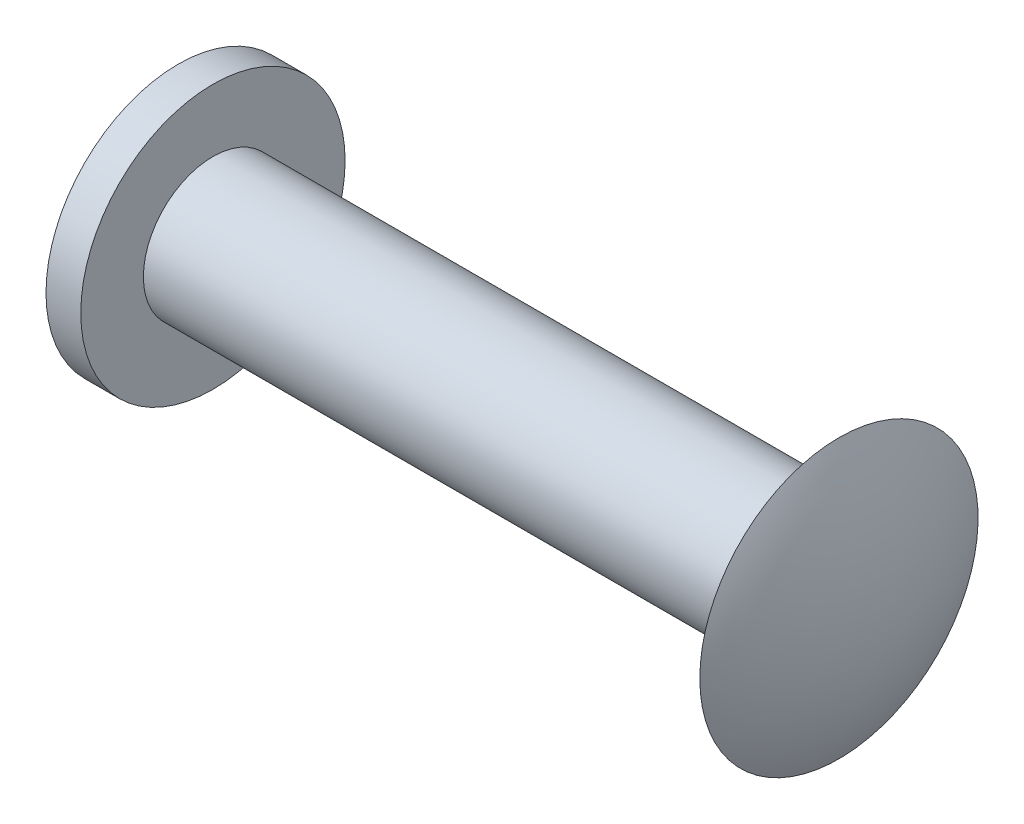
ISO-10303-21;
HEADER;
FILE_DESCRIPTION(('STEP AP214'),'2;1');
FILE_NAME('part.step','',(''),(''),'','','');
FILE_SCHEMA(('AUTOMOTIVE_DESIGN { 1 0 10303 214 1 1 1 1 }'));
ENDSEC;
DATA;
#1=APPLICATION_CONTEXT('core data for automotive mechanical design processes');
#2=APPLICATION_PROTOCOL_DEFINITION('international standard','automotive_design',2000,#1);
#3=PRODUCT_CONTEXT('',#1,'mechanical');
#4=PRODUCT('Part','Part','',(#3));
#5=PRODUCT_RELATED_PRODUCT_CATEGORY('part','',(#4));
#6=PRODUCT_DEFINITION_FORMATION('','',#4);
#7=PRODUCT_DEFINITION_CONTEXT('part definition',#1,'design');
#8=PRODUCT_DEFINITION('design','',#6,#7);
#9=PRODUCT_DEFINITION_SHAPE('','',#8);
#10=(LENGTH_UNIT() NAMED_UNIT(*) SI_UNIT(.MILLI.,.METRE.));
#11=(NAMED_UNIT(*) PLANE_ANGLE_UNIT() SI_UNIT($,.RADIAN.));
#12=(NAMED_UNIT(*) SI_UNIT($,.STERADIAN.) SOLID_ANGLE_UNIT());
#13=UNCERTAINTY_MEASURE_WITH_UNIT(LENGTH_MEASURE(1.E-05),#10,'distance_accuracy_value','');
#14=(GEOMETRIC_REPRESENTATION_CONTEXT(3) GLOBAL_UNCERTAINTY_ASSIGNED_CONTEXT((#13)) GLOBAL_UNIT_ASSIGNED_CONTEXT((#10,
#11,#12)) REPRESENTATION_CONTEXT('',''));
#15=CARTESIAN_POINT('',(0.,0.,0.));
#16=DIRECTION('',(0.,0.,1.));
#17=DIRECTION('',(1.,0.,0.));
#18=AXIS2_PLACEMENT_3D('',#15,#16,#17);
#19=CARTESIAN_POINT('',(0.,0.,0.));
#20=DIRECTION('',(1.,0.,0.));
#21=DIRECTION('',(0.,0.,-1.));
#22=AXIS2_PLACEMENT_3D('',#19,#20,#21);
#23=PLANE('',#22);
#24=CARTESIAN_POINT('',(0.,0.,0.));
#25=DIRECTION('',(-1.,0.,0.));
#26=DIRECTION('',(0.,0.,1.));
#27=AXIS2_PLACEMENT_3D('',#24,#25,#26);
#28=CIRCLE('',#27,1.9);
#29=CARTESIAN_POINT('',(0.,0.,1.9));
#30=VERTEX_POINT('',#29);
#31=EDGE_CURVE('E10',#30,#30,#28,.T.);
#32=ORIENTED_EDGE('',*,*,#31,.T.);
#33=EDGE_LOOP('',(#32));
#34=FACE_BOUND('',#33,.T.);
#35=ADVANCED_FACE('F38',(#34),#23,.F.);
#36=CARTESIAN_POINT('',(9.5,0.,0.));
#37=DIRECTION('',(-1.,0.,0.));
#38=DIRECTION('',(0.,0.,1.));
#39=AXIS2_PLACEMENT_3D('',#36,#37,#38);
#40=CYLINDRICAL_SURFACE('',#39,1.9);
#41=ORIENTED_EDGE('',*,*,#31,.F.);
#42=EDGE_LOOP('',(#41));
#43=FACE_BOUND('',#42,.T.);
#44=CARTESIAN_POINT('',(0.5,0.,0.));
#45=DIRECTION('',(-1.,0.,0.));
#46=DIRECTION('',(0.,0.,1.));
#47=AXIS2_PLACEMENT_3D('',#44,#45,#46);
#48=CIRCLE('',#47,1.9);
#49=CARTESIAN_POINT('',(0.5,0.,1.9));
#50=VERTEX_POINT('',#49);
#51=EDGE_CURVE('E45',#50,#50,#48,.T.);
#52=ORIENTED_EDGE('',*,*,#51,.T.);
#53=EDGE_LOOP('',(#52));
#54=FACE_BOUND('',#53,.T.);
#55=ADVANCED_FACE('F81',(#43,#54),#40,.T.);
#56=CARTESIAN_POINT('',(0.5,1.9,0.));
#57=DIRECTION('',(-1.,0.,0.));
#58=DIRECTION('',(0.,0.,1.));
#59=AXIS2_PLACEMENT_3D('',#56,#57,#58);
#60=PLANE('',#59);
#61=ORIENTED_EDGE('',*,*,#51,.F.);
#62=EDGE_LOOP('',(#61));
#63=FACE_BOUND('',#62,.T.);
#64=CARTESIAN_POINT('',(0.5,0.,0.));
#65=DIRECTION('',(-1.,0.,0.));
#66=DIRECTION('',(0.,0.,1.));
#67=AXIS2_PLACEMENT_3D('',#64,#65,#66);
#68=CIRCLE('',#67,1.);
#69=CARTESIAN_POINT('',(0.5,0.,1.));
#70=VERTEX_POINT('',#69);
#71=EDGE_CURVE('E52',#70,#70,#68,.T.);
#72=ORIENTED_EDGE('',*,*,#71,.T.);
#73=EDGE_LOOP('',(#72));
#74=FACE_BOUND('',#73,.T.);
#75=ADVANCED_FACE('F85',(#63,#74),#60,.F.);
#76=CARTESIAN_POINT('',(9.5,0.,0.));
#77=DIRECTION('',(-1.,0.,0.));
#78=DIRECTION('',(0.,0.,1.));
#79=AXIS2_PLACEMENT_3D('',#76,#77,#78);
#80=CYLINDRICAL_SURFACE('',#79,1.);
#81=ORIENTED_EDGE('',*,*,#71,.F.);
#82=EDGE_LOOP('',(#81));
#83=FACE_BOUND('',#82,.T.);
#84=CARTESIAN_POINT('',(9.5,0.,0.));
#85=DIRECTION('',(-1.,0.,0.));
#86=DIRECTION('',(0.,0.,1.));
#87=AXIS2_PLACEMENT_3D('',#84,#85,#86);
#88=CIRCLE('',#87,1.);
#89=CARTESIAN_POINT('',(9.5,0.,1.));
#90=VERTEX_POINT('',#89);
#91=EDGE_CURVE('E58',#90,#90,#88,.T.);
#92=ORIENTED_EDGE('',*,*,#91,.T.);
#93=EDGE_LOOP('',(#92));
#94=FACE_BOUND('',#93,.T.);
#95=ADVANCED_FACE('F77',(#83,#94),#80,.T.);
#96=CARTESIAN_POINT('',(9.5,1.,0.));
#97=DIRECTION('',(1.,0.,0.));
#98=DIRECTION('',(0.,0.,-1.));
#99=AXIS2_PLACEMENT_3D('',#96,#97,#98);
#100=PLANE('',#99);
#101=ORIENTED_EDGE('',*,*,#91,.F.);
#102=EDGE_LOOP('',(#101));
#103=FACE_BOUND('',#102,.T.);
#104=CARTESIAN_POINT('',(9.5,0.,0.));
#105=DIRECTION('',(-1.,0.,0.));
#106=DIRECTION('',(0.,0.,1.));
#107=AXIS2_PLACEMENT_3D('',#104,#105,#106);
#108=CIRCLE('',#107,2.);
#109=CARTESIAN_POINT('',(9.5,0.,2.));
#110=VERTEX_POINT('',#109);
#111=EDGE_CURVE('E64',#110,#110,#108,.T.);
#112=ORIENTED_EDGE('',*,*,#111,.T.);
#113=EDGE_LOOP('',(#112));
#114=FACE_BOUND('',#113,.T.);
#115=ADVANCED_FACE('F69',(#103,#114),#100,.F.);
#116=CARTESIAN_POINT('',(5.75000000000002,0.,0.));
#117=DIRECTION('',(-1.,0.,0.));
#118=DIRECTION('',(0.,1.,0.));
#119=AXIS2_PLACEMENT_3D('',#116,#117,#118);
#120=SPHERICAL_SURFACE('',#119,4.24999999999998);
#121=ORIENTED_EDGE('',*,*,#111,.F.);
#122=EDGE_LOOP('',(#121));
#123=FACE_BOUND('',#122,.T.);
#124=ADVANCED_FACE('F71',(#123),#120,.T.);
#125=CLOSED_SHELL('',(#35,#55,#75,#95,#115,#124));
#126=MANIFOLD_SOLID_BREP('B2',#125);
#127=ADVANCED_BREP_SHAPE_REPRESENTATION('',(#18,#126),#14);
#128=SHAPE_DEFINITION_REPRESENTATION(#9,#127);
ENDSEC;
END-ISO-10303-21;
